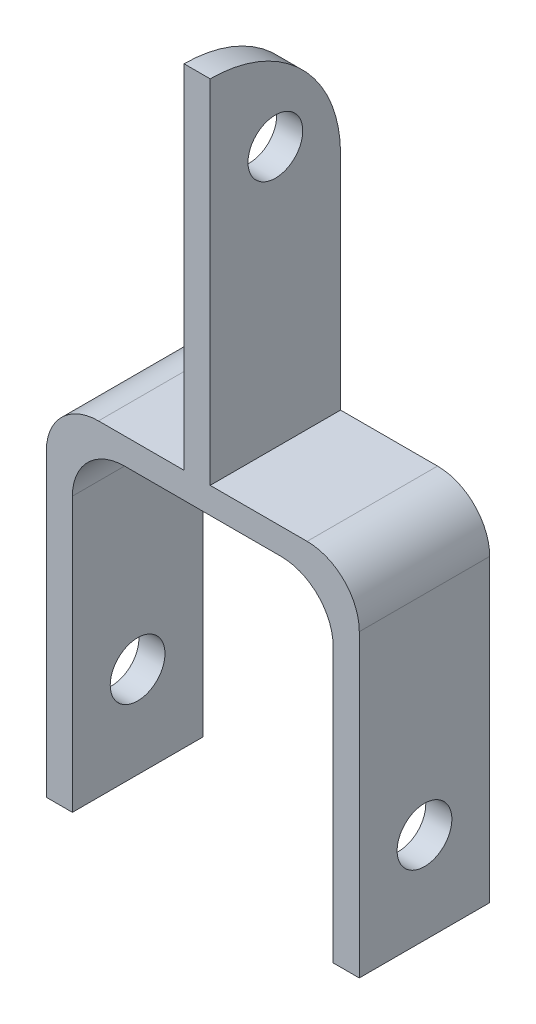
ISO-10303-21;
HEADER;
FILE_DESCRIPTION(('STEP AP214'),'2;1');
FILE_NAME('part.step','',(''),(''),'','','');
FILE_SCHEMA(('AUTOMOTIVE_DESIGN { 1 0 10303 214 1 1 1 1 }'));
ENDSEC;
DATA;
#1=APPLICATION_CONTEXT('core data for automotive mechanical design processes');
#2=APPLICATION_PROTOCOL_DEFINITION('international standard','automotive_design',2000,#1);
#3=PRODUCT_CONTEXT('',#1,'mechanical');
#4=PRODUCT('Part','Part','',(#3));
#5=PRODUCT_RELATED_PRODUCT_CATEGORY('part','',(#4));
#6=PRODUCT_DEFINITION_FORMATION('','',#4);
#7=PRODUCT_DEFINITION_CONTEXT('part definition',#1,'design');
#8=PRODUCT_DEFINITION('design','',#6,#7);
#9=PRODUCT_DEFINITION_SHAPE('','',#8);
#10=(LENGTH_UNIT() NAMED_UNIT(*) SI_UNIT(.MILLI.,.METRE.));
#11=(NAMED_UNIT(*) PLANE_ANGLE_UNIT() SI_UNIT($,.RADIAN.));
#12=(NAMED_UNIT(*) SI_UNIT($,.STERADIAN.) SOLID_ANGLE_UNIT());
#13=UNCERTAINTY_MEASURE_WITH_UNIT(LENGTH_MEASURE(1.E-05),#10,'distance_accuracy_value','');
#14=(GEOMETRIC_REPRESENTATION_CONTEXT(3) GLOBAL_UNCERTAINTY_ASSIGNED_CONTEXT((#13)) GLOBAL_UNIT_ASSIGNED_CONTEXT((#10,
#11,#12)) REPRESENTATION_CONTEXT('',''));
#15=CARTESIAN_POINT('',(0.,0.,0.));
#16=DIRECTION('',(0.,0.,1.));
#17=DIRECTION('',(1.,0.,0.));
#18=AXIS2_PLACEMENT_3D('',#15,#16,#17);
#19=CARTESIAN_POINT('',(0.,34.2900000000003,12.7000000000001));
#20=DIRECTION('',(1.,0.,0.));
#21=DIRECTION('',(0.,0.,-1.));
#22=AXIS2_PLACEMENT_3D('',#19,#20,#21);
#23=PLANE('',#22);
#24=CARTESIAN_POINT('',(0.,8.89000000000029,6.35000000000008));
#25=DIRECTION('',(-1.,0.,0.));
#26=DIRECTION('',(0.,0.,1.));
#27=AXIS2_PLACEMENT_3D('',#24,#25,#26);
#28=CIRCLE('',#27,2.667);
#29=CARTESIAN_POINT('',(0.,8.89000000000029,9.01700000000008));
#30=VERTEX_POINT('',#29);
#31=EDGE_CURVE('E332',#30,#30,#28,.T.);
#32=ORIENTED_EDGE('',*,*,#31,.F.);
#33=EDGE_LOOP('',(#32));
#34=FACE_BOUND('',#33,.T.);
#35=DIRECTION('',(0.,-1.,0.));
#36=VECTOR('',#35,1.);
#37=CARTESIAN_POINT('',(0.,34.2900000000003,12.7000000000001));
#38=LINE('',#37,#36);
#39=CARTESIAN_POINT('',(1.11022302462516E-13,29.2100000000003,12.7000000000002));
#40=VERTEX_POINT('',#39);
#41=CARTESIAN_POINT('',(0.,0.,12.7000000000002));
#42=VERTEX_POINT('',#41);
#43=EDGE_CURVE('E152',#40,#42,#38,.T.);
#44=ORIENTED_EDGE('',*,*,#43,.F.);
#45=DIRECTION('',(0.,0.,-1.));
#46=VECTOR('',#45,1.);
#47=CARTESIAN_POINT('',(1.11022302462516E-13,29.2100000000003,12.7000000000002));
#48=LINE('',#47,#46);
#49=CARTESIAN_POINT('',(0.,29.2100000000003,0.));
#50=VERTEX_POINT('',#49);
#51=EDGE_CURVE('E198',#40,#50,#48,.T.);
#52=ORIENTED_EDGE('',*,*,#51,.T.);
#53=DIRECTION('',(0.,-1.,0.));
#54=VECTOR('',#53,1.);
#55=CARTESIAN_POINT('',(0.,34.2900000000003,0.));
#56=LINE('',#55,#54);
#57=CARTESIAN_POINT('',(0.,0.,0.));
#58=VERTEX_POINT('',#57);
#59=EDGE_CURVE('E177',#50,#58,#56,.T.);
#60=ORIENTED_EDGE('',*,*,#59,.T.);
#61=DIRECTION('',(0.,0.,-1.));
#62=VECTOR('',#61,1.);
#63=CARTESIAN_POINT('',(0.,0.,12.7000000000002));
#64=LINE('',#63,#62);
#65=EDGE_CURVE('E170',#42,#58,#64,.T.);
#66=ORIENTED_EDGE('',*,*,#65,.F.);
#67=EDGE_LOOP('',(#44,#52,#60,#66));
#68=FACE_BOUND('',#67,.T.);
#69=ADVANCED_FACE('F41',(#34,#68),#23,.F.);
#70=CARTESIAN_POINT('',(0.,0.,12.7000000000002));
#71=DIRECTION('',(0.,1.,0.));
#72=DIRECTION('',(0.,0.,1.));
#73=AXIS2_PLACEMENT_3D('',#70,#71,#72);
#74=PLANE('',#73);
#75=DIRECTION('',(1.,0.,0.));
#76=VECTOR('',#75,1.);
#77=CARTESIAN_POINT('',(0.,0.,0.));
#78=LINE('',#77,#76);
#79=CARTESIAN_POINT('',(2.54000000000008,2.77555756156289E-13,1.11022302462516E-13));
#80=VERTEX_POINT('',#79);
#81=EDGE_CURVE('E254',#58,#80,#78,.T.);
#82=ORIENTED_EDGE('',*,*,#81,.T.);
#83=DIRECTION('',(0.,0.,-1.));
#84=VECTOR('',#83,1.);
#85=CARTESIAN_POINT('',(2.54000000000004,0.,12.7000000000002));
#86=LINE('',#85,#84);
#87=CARTESIAN_POINT('',(2.54000000000004,0.,12.7000000000002));
#88=VERTEX_POINT('',#87);
#89=EDGE_CURVE('E172',#88,#80,#86,.T.);
#90=ORIENTED_EDGE('',*,*,#89,.F.);
#91=DIRECTION('',(1.,0.,0.));
#92=VECTOR('',#91,1.);
#93=CARTESIAN_POINT('',(0.,0.,12.7000000000002));
#94=LINE('',#93,#92);
#95=EDGE_CURVE('E157',#42,#88,#94,.T.);
#96=ORIENTED_EDGE('',*,*,#95,.F.);
#97=ORIENTED_EDGE('',*,*,#65,.T.);
#98=EDGE_LOOP('',(#82,#90,#96,#97));
#99=FACE_BOUND('',#98,.T.);
#100=ADVANCED_FACE('F169',(#99),#74,.F.);
#101=CARTESIAN_POINT('',(2.54000000000004,0.,12.7000000000002));
#102=DIRECTION('',(-1.,0.,0.));
#103=DIRECTION('',(0.,0.,1.));
#104=AXIS2_PLACEMENT_3D('',#101,#102,#103);
#105=PLANE('',#104);
#106=CARTESIAN_POINT('',(2.54000000000011,8.89000000000029,6.35000000000008));
#107=DIRECTION('',(-1.,0.,0.));
#108=DIRECTION('',(0.,0.,1.));
#109=AXIS2_PLACEMENT_3D('',#106,#107,#108);
#110=CIRCLE('',#109,2.667);
#111=CARTESIAN_POINT('',(2.54000000000011,8.89000000000029,9.01700000000007));
#112=VERTEX_POINT('',#111);
#113=EDGE_CURVE('E326',#112,#112,#110,.T.);
#114=ORIENTED_EDGE('',*,*,#113,.T.);
#115=EDGE_LOOP('',(#114));
#116=FACE_BOUND('',#115,.T.);
#117=DIRECTION('',(0.,1.,0.));
#118=VECTOR('',#117,1.);
#119=CARTESIAN_POINT('',(2.54000000000008,2.77555756156289E-13,1.11022302462516E-13));
#120=LINE('',#119,#118);
#121=CARTESIAN_POINT('',(2.53999999999999,26.6700000000003,0.));
#122=VERTEX_POINT('',#121);
#123=EDGE_CURVE('E249',#80,#122,#120,.T.);
#124=ORIENTED_EDGE('',*,*,#123,.T.);
#125=DIRECTION('',(0.,0.,-1.));
#126=VECTOR('',#125,1.);
#127=CARTESIAN_POINT('',(2.54000000000004,26.6700000000003,12.7000000000002));
#128=LINE('',#127,#126);
#129=CARTESIAN_POINT('',(2.54000000000004,26.6700000000003,12.7000000000002));
#130=VERTEX_POINT('',#129);
#131=EDGE_CURVE('E193',#122,#130,#128,.F.);
#132=ORIENTED_EDGE('',*,*,#131,.T.);
#133=DIRECTION('',(0.,1.,0.));
#134=VECTOR('',#133,1.);
#135=CARTESIAN_POINT('',(2.54000000000004,0.,12.7000000000002));
#136=LINE('',#135,#134);
#137=EDGE_CURVE('E174',#88,#130,#136,.T.);
#138=ORIENTED_EDGE('',*,*,#137,.F.);
#139=ORIENTED_EDGE('',*,*,#89,.T.);
#140=EDGE_LOOP('',(#124,#132,#138,#139));
#141=FACE_BOUND('',#140,.T.);
#142=ADVANCED_FACE('F316',(#116,#141),#105,.F.);
#143=CARTESIAN_POINT('',(2.54,31.7500000000003,12.7));
#144=DIRECTION('',(0.,1.,0.));
#145=DIRECTION('',(0.,0.,1.));
#146=AXIS2_PLACEMENT_3D('',#143,#144,#145);
#147=PLANE('',#146);
#148=DIRECTION('',(1.,0.,0.));
#149=VECTOR('',#148,1.);
#150=CARTESIAN_POINT('',(2.54,31.7500000000003,12.7));
#151=LINE('',#150,#149);
#152=CARTESIAN_POINT('',(7.62000000000003,31.7500000000003,12.7));
#153=VERTEX_POINT('',#152);
#154=CARTESIAN_POINT('',(22.86,31.7500000000003,12.7000000000001));
#155=VERTEX_POINT('',#154);
#156=EDGE_CURVE('E228',#153,#155,#151,.T.);
#157=ORIENTED_EDGE('',*,*,#156,.F.);
#158=DIRECTION('',(0.,0.,-1.));
#159=VECTOR('',#158,1.);
#160=CARTESIAN_POINT('',(7.62000000000002,31.7500000000003,0.));
#161=LINE('',#160,#159);
#162=CARTESIAN_POINT('',(7.62000000000002,31.7500000000003,0.));
#163=VERTEX_POINT('',#162);
#164=EDGE_CURVE('E181',#153,#163,#161,.T.);
#165=ORIENTED_EDGE('',*,*,#164,.T.);
#166=DIRECTION('',(1.,0.,0.));
#167=VECTOR('',#166,1.);
#168=CARTESIAN_POINT('',(2.53999999999999,31.7500000000003,0.));
#169=LINE('',#168,#167);
#170=CARTESIAN_POINT('',(22.8599999999999,31.7500000000003,1.66533453693773E-13));
#171=VERTEX_POINT('',#170);
#172=EDGE_CURVE('E243',#163,#171,#169,.T.);
#173=ORIENTED_EDGE('',*,*,#172,.T.);
#174=DIRECTION('',(0.,0.,-1.));
#175=VECTOR('',#174,1.);
#176=CARTESIAN_POINT('',(22.86,31.7500000000003,12.7000000000001));
#177=LINE('',#176,#175);
#178=EDGE_CURVE('E179',#171,#155,#177,.F.);
#179=ORIENTED_EDGE('',*,*,#178,.T.);
#180=EDGE_LOOP('',(#157,#165,#173,#179));
#181=FACE_BOUND('',#180,.T.);
#182=ADVANCED_FACE('F247',(#181),#147,.F.);
#183=CARTESIAN_POINT('',(27.9400000000001,31.7500000000003,12.7));
#184=DIRECTION('',(1.,0.,0.));
#185=DIRECTION('',(0.,0.,-1.));
#186=AXIS2_PLACEMENT_3D('',#183,#184,#185);
#187=PLANE('',#186);
#188=CARTESIAN_POINT('',(27.9400000000001,8.89000000000084,6.35000000000019));
#189=DIRECTION('',(1.,0.,0.));
#190=DIRECTION('',(0.,0.,-1.));
#191=AXIS2_PLACEMENT_3D('',#188,#189,#190);
#192=CIRCLE('',#191,2.667);
#193=CARTESIAN_POINT('',(27.9400000000001,8.89000000000084,3.68300000000019));
#194=VERTEX_POINT('',#193);
#195=EDGE_CURVE('E313',#194,#194,#192,.T.);
#196=ORIENTED_EDGE('',*,*,#195,.T.);
#197=EDGE_LOOP('',(#196));
#198=FACE_BOUND('',#197,.T.);
#199=DIRECTION('',(0.,-1.,0.));
#200=VECTOR('',#199,1.);
#201=CARTESIAN_POINT('',(27.9400000000001,31.7500000000003,12.7));
#202=LINE('',#201,#200);
#203=CARTESIAN_POINT('',(27.9400000000001,26.6700000000003,12.7));
#204=VERTEX_POINT('',#203);
#205=CARTESIAN_POINT('',(27.94,5.55111512312578E-13,12.7000000000001));
#206=VERTEX_POINT('',#205);
#207=EDGE_CURVE('E225',#204,#206,#202,.T.);
#208=ORIENTED_EDGE('',*,*,#207,.F.);
#209=DIRECTION('',(0.,0.,-1.));
#210=VECTOR('',#209,1.);
#211=CARTESIAN_POINT('',(27.94,26.6700000000003,1.11022302462516E-13));
#212=LINE('',#211,#210);
#213=CARTESIAN_POINT('',(27.94,26.6700000000003,1.11022302462516E-13));
#214=VERTEX_POINT('',#213);
#215=EDGE_CURVE('E195',#204,#214,#212,.T.);
#216=ORIENTED_EDGE('',*,*,#215,.T.);
#217=DIRECTION('',(0.,-1.,0.));
#218=VECTOR('',#217,1.);
#219=CARTESIAN_POINT('',(27.94,31.7500000000003,1.11022302462516E-13));
#220=LINE('',#219,#218);
#221=CARTESIAN_POINT('',(27.94,5.55111512312578E-13,0.));
#222=VERTEX_POINT('',#221);
#223=EDGE_CURVE('E245',#214,#222,#220,.T.);
#224=ORIENTED_EDGE('',*,*,#223,.T.);
#225=DIRECTION('',(0.,0.,-1.));
#226=VECTOR('',#225,1.);
#227=CARTESIAN_POINT('',(27.94,5.55111512312578E-13,12.7000000000001));
#228=LINE('',#227,#226);
#229=EDGE_CURVE('E183',#206,#222,#228,.T.);
#230=ORIENTED_EDGE('',*,*,#229,.F.);
#231=EDGE_LOOP('',(#208,#216,#224,#230));
#232=FACE_BOUND('',#231,.T.);
#233=ADVANCED_FACE('F233',(#198,#232),#187,.F.);
#234=CARTESIAN_POINT('',(27.94,5.55111512312578E-13,12.7000000000001));
#235=DIRECTION('',(0.,1.,0.));
#236=DIRECTION('',(0.,0.,1.));
#237=AXIS2_PLACEMENT_3D('',#234,#235,#236);
#238=PLANE('',#237);
#239=DIRECTION('',(1.,0.,0.));
#240=VECTOR('',#239,1.);
#241=CARTESIAN_POINT('',(27.94,5.55111512312578E-13,0.));
#242=LINE('',#241,#240);
#243=CARTESIAN_POINT('',(30.4800000000001,5.55111512312578E-13,2.22044604925031E-13));
#244=VERTEX_POINT('',#243);
#245=EDGE_CURVE('E251',#222,#244,#242,.T.);
#246=ORIENTED_EDGE('',*,*,#245,.T.);
#247=DIRECTION('',(0.,0.,-1.));
#248=VECTOR('',#247,1.);
#249=CARTESIAN_POINT('',(30.48,5.55111512312578E-13,12.7));
#250=LINE('',#249,#248);
#251=CARTESIAN_POINT('',(30.48,5.55111512312578E-13,12.7));
#252=VERTEX_POINT('',#251);
#253=EDGE_CURVE('E277',#252,#244,#250,.T.);
#254=ORIENTED_EDGE('',*,*,#253,.F.);
#255=DIRECTION('',(1.,0.,0.));
#256=VECTOR('',#255,1.);
#257=CARTESIAN_POINT('',(27.94,5.55111512312578E-13,12.7000000000001));
#258=LINE('',#257,#256);
#259=EDGE_CURVE('E237',#206,#252,#258,.T.);
#260=ORIENTED_EDGE('',*,*,#259,.F.);
#261=ORIENTED_EDGE('',*,*,#229,.T.);
#262=EDGE_LOOP('',(#246,#254,#260,#261));
#263=FACE_BOUND('',#262,.T.);
#264=ADVANCED_FACE('F280',(#263),#238,.F.);
#265=CARTESIAN_POINT('',(30.48,34.2900000000004,12.7));
#266=DIRECTION('',(-1.,0.,0.));
#267=DIRECTION('',(0.,-1.,0.));
#268=AXIS2_PLACEMENT_3D('',#265,#266,#267);
#269=PLANE('',#268);
#270=CARTESIAN_POINT('',(30.4800000000001,8.89000000000084,6.35000000000008));
#271=DIRECTION('',(-1.,0.,0.));
#272=DIRECTION('',(0.,0.,1.));
#273=AXIS2_PLACEMENT_3D('',#270,#271,#272);
#274=CIRCLE('',#273,2.66699999999999);
#275=CARTESIAN_POINT('',(30.4800000000001,8.89000000000084,9.01700000000007));
#276=VERTEX_POINT('',#275);
#277=EDGE_CURVE('E329',#276,#276,#274,.T.);
#278=ORIENTED_EDGE('',*,*,#277,.T.);
#279=EDGE_LOOP('',(#278));
#280=FACE_BOUND('',#279,.T.);
#281=DIRECTION('',(0.,1.,0.));
#282=VECTOR('',#281,1.);
#283=CARTESIAN_POINT('',(30.48,34.2900000000003,1.11022302462516E-13));
#284=LINE('',#283,#282);
#285=CARTESIAN_POINT('',(30.48,29.2100000000003,1.11022302462516E-13));
#286=VERTEX_POINT('',#285);
#287=EDGE_CURVE('E259',#244,#286,#284,.T.);
#288=ORIENTED_EDGE('',*,*,#287,.T.);
#289=DIRECTION('',(0.,0.,-1.));
#290=VECTOR('',#289,1.);
#291=CARTESIAN_POINT('',(30.48,29.2100000000004,12.7));
#292=LINE('',#291,#290);
#293=CARTESIAN_POINT('',(30.48,29.2100000000004,12.7));
#294=VERTEX_POINT('',#293);
#295=EDGE_CURVE('E212',#286,#294,#292,.F.);
#296=ORIENTED_EDGE('',*,*,#295,.T.);
#297=DIRECTION('',(0.,1.,0.));
#298=VECTOR('',#297,1.);
#299=CARTESIAN_POINT('',(30.48,34.2900000000004,12.7));
#300=LINE('',#299,#298);
#301=EDGE_CURVE('E297',#252,#294,#300,.T.);
#302=ORIENTED_EDGE('',*,*,#301,.F.);
#303=ORIENTED_EDGE('',*,*,#253,.T.);
#304=EDGE_LOOP('',(#288,#296,#302,#303));
#305=FACE_BOUND('',#304,.T.);
#306=ADVANCED_FACE('F286',(#280,#305),#269,.F.);
#307=CARTESIAN_POINT('',(30.48,34.2900000000004,12.7));
#308=DIRECTION('',(0.,-1.,0.));
#309=DIRECTION('',(1.,0.,0.));
#310=AXIS2_PLACEMENT_3D('',#307,#308,#309);
#311=PLANE('',#310);
#312=DIRECTION('',(-1.,0.,0.));
#313=VECTOR('',#312,1.);
#314=CARTESIAN_POINT('',(30.48,34.2900000000004,12.7));
#315=LINE('',#314,#313);
#316=CARTESIAN_POINT('',(25.3999999999999,34.2900000000003,12.7000000000002));
#317=VERTEX_POINT('',#316);
#318=CARTESIAN_POINT('',(15.9578260869565,34.2900000000003,12.7));
#319=VERTEX_POINT('',#318);
#320=EDGE_CURVE('E295',#317,#319,#315,.T.);
#321=ORIENTED_EDGE('',*,*,#320,.F.);
#322=DIRECTION('',(0.,0.,-1.));
#323=VECTOR('',#322,1.);
#324=CARTESIAN_POINT('',(25.3999999999999,34.2900000000003,12.7000000000002));
#325=LINE('',#324,#323);
#326=CARTESIAN_POINT('',(25.3999999999999,34.2900000000003,2.22044604925031E-13));
#327=VERTEX_POINT('',#326);
#328=EDGE_CURVE('E209',#317,#327,#325,.T.);
#329=ORIENTED_EDGE('',*,*,#328,.T.);
#330=DIRECTION('',(-1.,0.,0.));
#331=VECTOR('',#330,1.);
#332=CARTESIAN_POINT('',(30.48,34.2900000000003,1.11022302462516E-13));
#333=LINE('',#332,#331);
#334=CARTESIAN_POINT('',(15.9578260869565,34.2900000000003,1.11022302462516E-13));
#335=VERTEX_POINT('',#334);
#336=EDGE_CURVE('E262',#327,#335,#333,.T.);
#337=ORIENTED_EDGE('',*,*,#336,.T.);
#338=DIRECTION('',(0.,0.,-1.));
#339=VECTOR('',#338,1.);
#340=CARTESIAN_POINT('',(15.9578260869565,34.2900000000003,12.7));
#341=LINE('',#340,#339);
#342=EDGE_CURVE('E273',#319,#335,#341,.T.);
#343=ORIENTED_EDGE('',*,*,#342,.F.);
#344=EDGE_LOOP('',(#321,#329,#337,#343));
#345=FACE_BOUND('',#344,.T.);
#346=ADVANCED_FACE('F299',(#345),#311,.F.);
#347=CARTESIAN_POINT('',(15.9578260869565,34.2900000000003,12.7));
#348=DIRECTION('',(-1.,0.,0.));
#349=DIRECTION('',(0.,-1.,0.));
#350=AXIS2_PLACEMENT_3D('',#347,#348,#349);
#351=PLANE('',#350);
#352=CARTESIAN_POINT('',(15.9578260869566,59.6900000000003,6.35000000000008));
#353=DIRECTION('',(-1.,0.,0.));
#354=DIRECTION('',(0.,-1.,0.));
#355=AXIS2_PLACEMENT_3D('',#352,#353,#354);
#356=CIRCLE('',#355,2.667);
#357=CARTESIAN_POINT('',(15.9578260869566,57.0230000000003,6.35000000000008));
#358=VERTEX_POINT('',#357);
#359=EDGE_CURVE('E189',#358,#358,#356,.T.);
#360=ORIENTED_EDGE('',*,*,#359,.T.);
#361=EDGE_LOOP('',(#360));
#362=FACE_BOUND('',#361,.T.);
#363=DIRECTION('',(0.,1.,0.));
#364=VECTOR('',#363,1.);
#365=CARTESIAN_POINT('',(15.9578260869565,34.2900000000003,1.11022302462516E-13));
#366=LINE('',#365,#364);
#367=CARTESIAN_POINT('',(15.9578260869566,55.8800000000003,1.11022302462516E-13));
#368=VERTEX_POINT('',#367);
#369=EDGE_CURVE('E264',#335,#368,#366,.T.);
#370=ORIENTED_EDGE('',*,*,#369,.T.);
#371=CARTESIAN_POINT('',(15.9578260869566,55.8800000000003,12.7000000000001));
#372=DIRECTION('',(-1.,0.,0.));
#373=DIRECTION('',(0.,-1.,0.));
#374=AXIS2_PLACEMENT_3D('',#371,#372,#373);
#375=CIRCLE('',#374,12.7);
#376=CARTESIAN_POINT('',(15.9578260869565,68.5800000000003,12.7));
#377=VERTEX_POINT('',#376);
#378=EDGE_CURVE('E11',#368,#377,#375,.F.);
#379=ORIENTED_EDGE('',*,*,#378,.T.);
#380=DIRECTION('',(0.,1.,0.));
#381=VECTOR('',#380,1.);
#382=CARTESIAN_POINT('',(15.9578260869565,34.2900000000003,12.7));
#383=LINE('',#382,#381);
#384=EDGE_CURVE('E301',#319,#377,#383,.T.);
#385=ORIENTED_EDGE('',*,*,#384,.F.);
#386=ORIENTED_EDGE('',*,*,#342,.T.);
#387=EDGE_LOOP('',(#370,#379,#385,#386));
#388=FACE_BOUND('',#387,.T.);
#389=ADVANCED_FACE('F338',(#362,#388),#351,.F.);
#390=CARTESIAN_POINT('',(13.4178260869565,68.5800000000003,12.7000000000001));
#391=DIRECTION('',(1.,0.,0.));
#392=DIRECTION('',(0.,0.,-1.));
#393=AXIS2_PLACEMENT_3D('',#390,#391,#392);
#394=PLANE('',#393);
#395=CARTESIAN_POINT('',(13.4178260869566,59.6900000000003,6.35000000000013));
#396=DIRECTION('',(1.,0.,0.));
#397=DIRECTION('',(0.,0.,-1.));
#398=AXIS2_PLACEMENT_3D('',#395,#396,#397);
#399=CIRCLE('',#398,2.667);
#400=CARTESIAN_POINT('',(13.4178260869566,59.6900000000003,3.68300000000014));
#401=VERTEX_POINT('',#400);
#402=EDGE_CURVE('E187',#401,#401,#399,.T.);
#403=ORIENTED_EDGE('',*,*,#402,.T.);
#404=EDGE_LOOP('',(#403));
#405=FACE_BOUND('',#404,.T.);
#406=DIRECTION('',(0.,-1.,0.));
#407=VECTOR('',#406,1.);
#408=CARTESIAN_POINT('',(13.4178260869565,68.5800000000003,12.7000000000001));
#409=LINE('',#408,#407);
#410=CARTESIAN_POINT('',(13.4178260869565,68.5800000000003,12.7000000000001));
#411=VERTEX_POINT('',#410);
#412=CARTESIAN_POINT('',(13.4178260869564,34.2900000000003,12.7000000000001));
#413=VERTEX_POINT('',#412);
#414=EDGE_CURVE('E310',#411,#413,#409,.T.);
#415=ORIENTED_EDGE('',*,*,#414,.F.);
#416=CARTESIAN_POINT('',(13.4178260869565,55.8800000000003,12.7000000000001));
#417=DIRECTION('',(1.,0.,0.));
#418=DIRECTION('',(0.,0.,-1.));
#419=AXIS2_PLACEMENT_3D('',#416,#417,#418);
#420=CIRCLE('',#419,12.7);
#421=CARTESIAN_POINT('',(13.4178260869565,55.8800000000003,1.66533453693773E-13));
#422=VERTEX_POINT('',#421);
#423=EDGE_CURVE('E63',#411,#422,#420,.F.);
#424=ORIENTED_EDGE('',*,*,#423,.T.);
#425=DIRECTION('',(0.,-1.,0.));
#426=VECTOR('',#425,1.);
#427=CARTESIAN_POINT('',(13.4178260869565,68.5800000000003,1.94289029309402E-13));
#428=LINE('',#427,#426);
#429=CARTESIAN_POINT('',(13.4178260869565,34.2900000000003,1.11022302462516E-13));
#430=VERTEX_POINT('',#429);
#431=EDGE_CURVE('E266',#422,#430,#428,.T.);
#432=ORIENTED_EDGE('',*,*,#431,.T.);
#433=DIRECTION('',(0.,0.,-1.));
#434=VECTOR('',#433,1.);
#435=CARTESIAN_POINT('',(13.4178260869564,34.2900000000003,12.7000000000001));
#436=LINE('',#435,#434);
#437=EDGE_CURVE('E270',#413,#430,#436,.T.);
#438=ORIENTED_EDGE('',*,*,#437,.F.);
#439=EDGE_LOOP('',(#415,#424,#432,#438));
#440=FACE_BOUND('',#439,.T.);
#441=ADVANCED_FACE('F380',(#405,#440),#394,.F.);
#442=CARTESIAN_POINT('',(13.4178260869564,34.2900000000003,12.7000000000001));
#443=DIRECTION('',(0.,-1.,0.));
#444=DIRECTION('',(0.,0.,-1.));
#445=AXIS2_PLACEMENT_3D('',#442,#443,#444);
#446=PLANE('',#445);
#447=DIRECTION('',(-1.,0.,0.));
#448=VECTOR('',#447,1.);
#449=CARTESIAN_POINT('',(13.4178260869565,34.2900000000003,1.11022302462516E-13));
#450=LINE('',#449,#448);
#451=CARTESIAN_POINT('',(5.08,34.2900000000003,1.66533453693773E-13));
#452=VERTEX_POINT('',#451);
#453=EDGE_CURVE('E165',#430,#452,#450,.T.);
#454=ORIENTED_EDGE('',*,*,#453,.T.);
#455=DIRECTION('',(0.,0.,-1.));
#456=VECTOR('',#455,1.);
#457=CARTESIAN_POINT('',(5.08000000000002,34.2900000000003,12.7000000000002));
#458=LINE('',#457,#456);
#459=CARTESIAN_POINT('',(5.08000000000002,34.2900000000003,12.7000000000002));
#460=VERTEX_POINT('',#459);
#461=EDGE_CURVE('E204',#452,#460,#458,.F.);
#462=ORIENTED_EDGE('',*,*,#461,.T.);
#463=DIRECTION('',(-1.,0.,0.));
#464=VECTOR('',#463,1.);
#465=CARTESIAN_POINT('',(13.4178260869564,34.2900000000003,12.7000000000001));
#466=LINE('',#465,#464);
#467=EDGE_CURVE('E274',#413,#460,#466,.T.);
#468=ORIENTED_EDGE('',*,*,#467,.F.);
#469=ORIENTED_EDGE('',*,*,#437,.T.);
#470=EDGE_LOOP('',(#454,#462,#468,#469));
#471=FACE_BOUND('',#470,.T.);
#472=ADVANCED_FACE('F384',(#471),#446,.F.);
#473=CARTESIAN_POINT('',(0.,0.,12.7000000000002));
#474=DIRECTION('',(0.,0.,1.));
#475=DIRECTION('',(1.,0.,0.));
#476=AXIS2_PLACEMENT_3D('',#473,#474,#475);
#477=PLANE('',#476);
#478=ORIENTED_EDGE('',*,*,#467,.T.);
#479=CARTESIAN_POINT('',(5.08000000000003,29.2100000000003,12.7000000000002));
#480=DIRECTION('',(0.,0.,1.));
#481=DIRECTION('',(1.,0.,0.));
#482=AXIS2_PLACEMENT_3D('',#479,#480,#481);
#483=CIRCLE('',#482,5.08);
#484=EDGE_CURVE('E160',#460,#40,#483,.T.);
#485=ORIENTED_EDGE('',*,*,#484,.T.);
#486=ORIENTED_EDGE('',*,*,#43,.T.);
#487=ORIENTED_EDGE('',*,*,#95,.T.);
#488=ORIENTED_EDGE('',*,*,#137,.T.);
#489=CARTESIAN_POINT('',(7.62000000000002,26.6700000000003,12.7000000000002));
#490=DIRECTION('',(0.,0.,1.));
#491=DIRECTION('',(1.,0.,0.));
#492=AXIS2_PLACEMENT_3D('',#489,#490,#491);
#493=CIRCLE('',#492,5.08);
#494=EDGE_CURVE('E216',#130,#153,#493,.F.);
#495=ORIENTED_EDGE('',*,*,#494,.T.);
#496=ORIENTED_EDGE('',*,*,#156,.T.);
#497=CARTESIAN_POINT('',(22.86,26.6700000000003,12.7000000000001));
#498=DIRECTION('',(0.,0.,1.));
#499=DIRECTION('',(1.,0.,0.));
#500=AXIS2_PLACEMENT_3D('',#497,#498,#499);
#501=CIRCLE('',#500,5.08);
#502=EDGE_CURVE('E220',#155,#204,#501,.F.);
#503=ORIENTED_EDGE('',*,*,#502,.T.);
#504=ORIENTED_EDGE('',*,*,#207,.T.);
#505=ORIENTED_EDGE('',*,*,#259,.T.);
#506=ORIENTED_EDGE('',*,*,#301,.T.);
#507=CARTESIAN_POINT('',(25.4,29.2100000000003,12.7));
#508=DIRECTION('',(0.,0.,1.));
#509=DIRECTION('',(1.,0.,0.));
#510=AXIS2_PLACEMENT_3D('',#507,#508,#509);
#511=CIRCLE('',#510,5.08);
#512=EDGE_CURVE('E206',#294,#317,#511,.T.);
#513=ORIENTED_EDGE('',*,*,#512,.T.);
#514=ORIENTED_EDGE('',*,*,#320,.T.);
#515=ORIENTED_EDGE('',*,*,#384,.T.);
#516=DIRECTION('',(-1.,0.,0.));
#517=VECTOR('',#516,1.);
#518=CARTESIAN_POINT('',(15.9578260869565,68.5800000000003,12.7));
#519=LINE('',#518,#517);
#520=EDGE_CURVE('E303',#377,#411,#519,.T.);
#521=ORIENTED_EDGE('',*,*,#520,.T.);
#522=ORIENTED_EDGE('',*,*,#414,.T.);
#523=EDGE_LOOP('',(#478,#485,#486,#487,#488,#495,#496,#503,#504,#505,#506,#513,#514,#515,#521,#522));
#524=FACE_BOUND('',#523,.T.);
#525=ADVANCED_FACE('F155',(#524),#477,.T.);
#526=CARTESIAN_POINT('',(0.,0.,0.));
#527=DIRECTION('',(0.,0.,1.));
#528=DIRECTION('',(1.,0.,0.));
#529=AXIS2_PLACEMENT_3D('',#526,#527,#528);
#530=PLANE('',#529);
#531=ORIENTED_EDGE('',*,*,#431,.F.);
#532=DIRECTION('',(-1.,0.,0.));
#533=VECTOR('',#532,1.);
#534=CARTESIAN_POINT('',(1.11022302462516E-13,55.8800000000003,1.38777878078145E-13));
#535=LINE('',#534,#533);
#536=EDGE_CURVE('E49',#422,#368,#535,.F.);
#537=ORIENTED_EDGE('',*,*,#536,.T.);
#538=ORIENTED_EDGE('',*,*,#369,.F.);
#539=ORIENTED_EDGE('',*,*,#336,.F.);
#540=CARTESIAN_POINT('',(25.4,29.2100000000003,0.));
#541=DIRECTION('',(0.,0.,1.));
#542=DIRECTION('',(1.,0.,0.));
#543=AXIS2_PLACEMENT_3D('',#540,#541,#542);
#544=CIRCLE('',#543,5.08);
#545=EDGE_CURVE('E200',#327,#286,#544,.F.);
#546=ORIENTED_EDGE('',*,*,#545,.T.);
#547=ORIENTED_EDGE('',*,*,#287,.F.);
#548=ORIENTED_EDGE('',*,*,#245,.F.);
#549=ORIENTED_EDGE('',*,*,#223,.F.);
#550=CARTESIAN_POINT('',(22.8599999999999,26.6700000000003,1.66533453693773E-13));
#551=DIRECTION('',(0.,0.,1.));
#552=DIRECTION('',(1.,0.,0.));
#553=AXIS2_PLACEMENT_3D('',#550,#551,#552);
#554=CIRCLE('',#553,5.08);
#555=EDGE_CURVE('E218',#214,#171,#554,.T.);
#556=ORIENTED_EDGE('',*,*,#555,.T.);
#557=ORIENTED_EDGE('',*,*,#172,.F.);
#558=CARTESIAN_POINT('',(7.62000000000002,26.6700000000003,0.));
#559=DIRECTION('',(0.,0.,1.));
#560=DIRECTION('',(1.,0.,0.));
#561=AXIS2_PLACEMENT_3D('',#558,#559,#560);
#562=CIRCLE('',#561,5.08);
#563=EDGE_CURVE('E214',#163,#122,#562,.T.);
#564=ORIENTED_EDGE('',*,*,#563,.T.);
#565=ORIENTED_EDGE('',*,*,#123,.F.);
#566=ORIENTED_EDGE('',*,*,#81,.F.);
#567=ORIENTED_EDGE('',*,*,#59,.F.);
#568=CARTESIAN_POINT('',(5.08000000000003,29.2100000000003,0.));
#569=DIRECTION('',(0.,0.,1.));
#570=DIRECTION('',(1.,0.,0.));
#571=AXIS2_PLACEMENT_3D('',#568,#569,#570);
#572=CIRCLE('',#571,5.08);
#573=EDGE_CURVE('E202',#50,#452,#572,.F.);
#574=ORIENTED_EDGE('',*,*,#573,.T.);
#575=ORIENTED_EDGE('',*,*,#453,.F.);
#576=EDGE_LOOP('',(#531,#537,#538,#539,#546,#547,#548,#549,#556,#557,#564,#565,#566,#567,#574,#575));
#577=FACE_BOUND('',#576,.T.);
#578=ADVANCED_FACE('F242',(#577),#530,.F.);
#579=CARTESIAN_POINT('',(0.,8.89000000000029,6.35000000000008));
#580=DIRECTION('',(-1.,0.,0.));
#581=DIRECTION('',(0.,0.,1.));
#582=AXIS2_PLACEMENT_3D('',#579,#580,#581);
#583=CYLINDRICAL_SURFACE('',#582,2.667);
#584=ORIENTED_EDGE('',*,*,#31,.T.);
#585=EDGE_LOOP('',(#584));
#586=FACE_BOUND('',#585,.T.);
#587=ORIENTED_EDGE('',*,*,#113,.F.);
#588=EDGE_LOOP('',(#587));
#589=FACE_BOUND('',#588,.T.);
#590=ADVANCED_FACE('F351',(#586,#589),#583,.F.);
#591=ORIENTED_EDGE('',*,*,#277,.F.);
#592=EDGE_LOOP('',(#591));
#593=FACE_BOUND('',#592,.T.);
#594=ORIENTED_EDGE('',*,*,#195,.F.);
#595=EDGE_LOOP('',(#594));
#596=FACE_BOUND('',#595,.T.);
#597=ADVANCED_FACE('F343',(#593,#596),#583,.F.);
#598=CARTESIAN_POINT('',(0.,59.6900000000003,6.35000000000013));
#599=DIRECTION('',(-1.,0.,0.));
#600=DIRECTION('',(0.,0.,1.));
#601=AXIS2_PLACEMENT_3D('',#598,#599,#600);
#602=CYLINDRICAL_SURFACE('',#601,2.667);
#603=ORIENTED_EDGE('',*,*,#402,.F.);
#604=EDGE_LOOP('',(#603));
#605=FACE_BOUND('',#604,.T.);
#606=ORIENTED_EDGE('',*,*,#359,.F.);
#607=EDGE_LOOP('',(#606));
#608=FACE_BOUND('',#607,.T.);
#609=ADVANCED_FACE('F341',(#605,#608),#602,.F.);
#610=CARTESIAN_POINT('',(7.62000000000002,26.6700000000003,12.7000000000002));
#611=DIRECTION('',(0.,0.,1.));
#612=DIRECTION('',(1.,0.,0.));
#613=AXIS2_PLACEMENT_3D('',#610,#611,#612);
#614=CYLINDRICAL_SURFACE('',#613,5.08);
#615=ORIENTED_EDGE('',*,*,#494,.F.);
#616=ORIENTED_EDGE('',*,*,#131,.F.);
#617=ORIENTED_EDGE('',*,*,#563,.F.);
#618=ORIENTED_EDGE('',*,*,#164,.F.);
#619=EDGE_LOOP('',(#615,#616,#617,#618));
#620=FACE_BOUND('',#619,.T.);
#621=ADVANCED_FACE('F320',(#620),#614,.F.);
#622=CARTESIAN_POINT('',(22.86,26.6700000000003,12.7000000000001));
#623=DIRECTION('',(0.,0.,1.));
#624=DIRECTION('',(1.,0.,0.));
#625=AXIS2_PLACEMENT_3D('',#622,#623,#624);
#626=CYLINDRICAL_SURFACE('',#625,5.08);
#627=ORIENTED_EDGE('',*,*,#502,.F.);
#628=ORIENTED_EDGE('',*,*,#178,.F.);
#629=ORIENTED_EDGE('',*,*,#555,.F.);
#630=ORIENTED_EDGE('',*,*,#215,.F.);
#631=EDGE_LOOP('',(#627,#628,#629,#630));
#632=FACE_BOUND('',#631,.T.);
#633=ADVANCED_FACE('F239',(#632),#626,.F.);
#634=CARTESIAN_POINT('',(5.08000000000003,29.2100000000003,12.7000000000002));
#635=DIRECTION('',(0.,0.,-1.));
#636=DIRECTION('',(-1.,0.,0.));
#637=AXIS2_PLACEMENT_3D('',#634,#635,#636);
#638=CYLINDRICAL_SURFACE('',#637,5.08);
#639=ORIENTED_EDGE('',*,*,#484,.F.);
#640=ORIENTED_EDGE('',*,*,#461,.F.);
#641=ORIENTED_EDGE('',*,*,#573,.F.);
#642=ORIENTED_EDGE('',*,*,#51,.F.);
#643=EDGE_LOOP('',(#639,#640,#641,#642));
#644=FACE_BOUND('',#643,.T.);
#645=ADVANCED_FACE('F367',(#644),#638,.T.);
#646=CARTESIAN_POINT('',(25.4,29.2100000000003,12.7));
#647=DIRECTION('',(0.,0.,-1.));
#648=DIRECTION('',(-1.,0.,0.));
#649=AXIS2_PLACEMENT_3D('',#646,#647,#648);
#650=CYLINDRICAL_SURFACE('',#649,5.08);
#651=ORIENTED_EDGE('',*,*,#512,.F.);
#652=ORIENTED_EDGE('',*,*,#295,.F.);
#653=ORIENTED_EDGE('',*,*,#545,.F.);
#654=ORIENTED_EDGE('',*,*,#328,.F.);
#655=EDGE_LOOP('',(#651,#652,#653,#654));
#656=FACE_BOUND('',#655,.T.);
#657=ADVANCED_FACE('F291',(#656),#650,.T.);
#658=CARTESIAN_POINT('',(15.9578260869566,55.8800000000003,12.7000000000001));
#659=DIRECTION('',(-1.,0.,0.));
#660=DIRECTION('',(0.,0.,1.));
#661=AXIS2_PLACEMENT_3D('',#658,#659,#660);
#662=CYLINDRICAL_SURFACE('',#661,12.7);
#663=ORIENTED_EDGE('',*,*,#378,.F.);
#664=ORIENTED_EDGE('',*,*,#536,.F.);
#665=ORIENTED_EDGE('',*,*,#423,.F.);
#666=ORIENTED_EDGE('',*,*,#520,.F.);
#667=EDGE_LOOP('',(#663,#664,#665,#666));
#668=FACE_BOUND('',#667,.T.);
#669=ADVANCED_FACE('F43',(#668),#662,.T.);
#670=CLOSED_SHELL('',(#69,#100,#142,#182,#233,#264,#306,#346,#389,#441,#472,#525,#578,#590,#597,
#609,#621,#633,#645,#657,#669));
#671=MANIFOLD_SOLID_BREP('B2',#670);
#672=ADVANCED_BREP_SHAPE_REPRESENTATION('',(#18,#671),#14);
#673=SHAPE_DEFINITION_REPRESENTATION(#9,#672);
ENDSEC;
END-ISO-10303-21;
